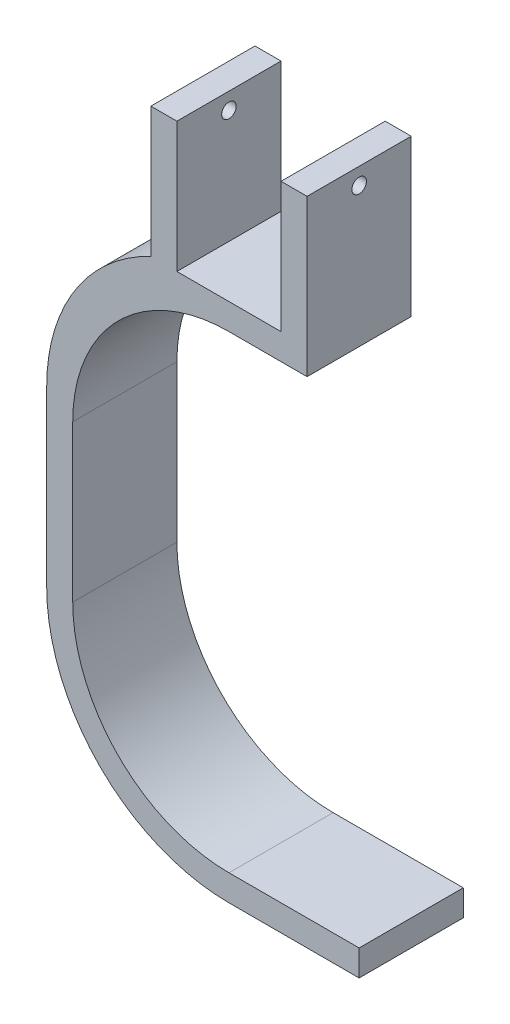
ISO-10303-21;
HEADER;
FILE_DESCRIPTION(('STEP AP214'),'2;1');
FILE_NAME('part.step','',(''),(''),'','','');
FILE_SCHEMA(('AUTOMOTIVE_DESIGN { 1 0 10303 214 1 1 1 1 }'));
ENDSEC;
DATA;
#1=APPLICATION_CONTEXT('core data for automotive mechanical design processes');
#2=APPLICATION_PROTOCOL_DEFINITION('international standard','automotive_design',2000,#1);
#3=PRODUCT_CONTEXT('',#1,'mechanical');
#4=PRODUCT('Part','Part','',(#3));
#5=PRODUCT_RELATED_PRODUCT_CATEGORY('part','',(#4));
#6=PRODUCT_DEFINITION_FORMATION('','',#4);
#7=PRODUCT_DEFINITION_CONTEXT('part definition',#1,'design');
#8=PRODUCT_DEFINITION('design','',#6,#7);
#9=PRODUCT_DEFINITION_SHAPE('','',#8);
#10=(LENGTH_UNIT() NAMED_UNIT(*) SI_UNIT(.MILLI.,.METRE.));
#11=(NAMED_UNIT(*) PLANE_ANGLE_UNIT() SI_UNIT($,.RADIAN.));
#12=(NAMED_UNIT(*) SI_UNIT($,.STERADIAN.) SOLID_ANGLE_UNIT());
#13=UNCERTAINTY_MEASURE_WITH_UNIT(LENGTH_MEASURE(1.E-05),#10,'distance_accuracy_value','');
#14=(GEOMETRIC_REPRESENTATION_CONTEXT(3) GLOBAL_UNCERTAINTY_ASSIGNED_CONTEXT((#13)) GLOBAL_UNIT_ASSIGNED_CONTEXT((#10,
#11,#12)) REPRESENTATION_CONTEXT('',''));
#15=CARTESIAN_POINT('',(0.,0.,0.));
#16=DIRECTION('',(0.,0.,1.));
#17=DIRECTION('',(1.,0.,0.));
#18=AXIS2_PLACEMENT_3D('',#15,#16,#17);
#19=CARTESIAN_POINT('',(0.,-55.535197077931,20.));
#20=DIRECTION('',(0.,1.,0.));
#21=DIRECTION('',(0.,0.,1.));
#22=AXIS2_PLACEMENT_3D('',#19,#20,#21);
#23=PLANE('',#22);
#24=DIRECTION('',(1.,0.,0.));
#25=VECTOR('',#24,1.);
#26=CARTESIAN_POINT('',(0.,-55.535197077931,20.));
#27=LINE('',#26,#25);
#28=CARTESIAN_POINT('',(21.4485078252592,-55.535197077931,20.));
#29=VERTEX_POINT('',#28);
#30=CARTESIAN_POINT('',(46.4485078252592,-55.535197077931,20.));
#31=VERTEX_POINT('',#30);
#32=EDGE_CURVE('E207',#29,#31,#27,.T.);
#33=ORIENTED_EDGE('',*,*,#32,.F.);
#34=DIRECTION('',(0.,0.,-1.));
#35=VECTOR('',#34,1.);
#36=CARTESIAN_POINT('',(21.4485078252592,-55.535197077931,20.));
#37=LINE('',#36,#35);
#38=CARTESIAN_POINT('',(21.4485078252592,-55.535197077931,0.));
#39=VERTEX_POINT('',#38);
#40=EDGE_CURVE('E286',#29,#39,#37,.T.);
#41=ORIENTED_EDGE('',*,*,#40,.T.);
#42=DIRECTION('',(1.,0.,0.));
#43=VECTOR('',#42,1.);
#44=CARTESIAN_POINT('',(0.,-55.535197077931,0.));
#45=LINE('',#44,#43);
#46=CARTESIAN_POINT('',(46.4485078252592,-55.535197077931,0.));
#47=VERTEX_POINT('',#46);
#48=EDGE_CURVE('E206',#39,#47,#45,.T.);
#49=ORIENTED_EDGE('',*,*,#48,.T.);
#50=DIRECTION('',(0.,0.,-1.));
#51=VECTOR('',#50,1.);
#52=CARTESIAN_POINT('',(46.4485078252592,-55.535197077931,20.));
#53=LINE('',#52,#51);
#54=EDGE_CURVE('E265',#31,#47,#53,.T.);
#55=ORIENTED_EDGE('',*,*,#54,.F.);
#56=EDGE_LOOP('',(#33,#41,#49,#55));
#57=FACE_BOUND('',#56,.T.);
#58=ADVANCED_FACE('F37',(#57),#23,.F.);
#59=CARTESIAN_POINT('',(46.4485078252592,0.,20.));
#60=DIRECTION('',(-1.,0.,0.));
#61=DIRECTION('',(0.,0.,1.));
#62=AXIS2_PLACEMENT_3D('',#59,#60,#61);
#63=PLANE('',#62);
#64=DIRECTION('',(0.,1.,0.));
#65=VECTOR('',#64,1.);
#66=CARTESIAN_POINT('',(46.4485078252592,0.,0.));
#67=LINE('',#66,#65);
#68=CARTESIAN_POINT('',(46.4485078252592,-50.535197077931,0.));
#69=VERTEX_POINT('',#68);
#70=EDGE_CURVE('E237',#47,#69,#67,.T.);
#71=ORIENTED_EDGE('',*,*,#70,.T.);
#72=DIRECTION('',(0.,0.,-1.));
#73=VECTOR('',#72,1.);
#74=CARTESIAN_POINT('',(46.4485078252592,-50.535197077931,20.));
#75=LINE('',#74,#73);
#76=CARTESIAN_POINT('',(46.4485078252592,-50.535197077931,20.));
#77=VERTEX_POINT('',#76);
#78=EDGE_CURVE('E262',#77,#69,#75,.T.);
#79=ORIENTED_EDGE('',*,*,#78,.F.);
#80=DIRECTION('',(0.,1.,0.));
#81=VECTOR('',#80,1.);
#82=CARTESIAN_POINT('',(46.4485078252592,0.,20.));
#83=LINE('',#82,#81);
#84=EDGE_CURVE('E209',#31,#77,#83,.T.);
#85=ORIENTED_EDGE('',*,*,#84,.F.);
#86=ORIENTED_EDGE('',*,*,#54,.T.);
#87=EDGE_LOOP('',(#71,#79,#85,#86));
#88=FACE_BOUND('',#87,.T.);
#89=ADVANCED_FACE('F315',(#88),#63,.F.);
#90=CARTESIAN_POINT('',(0.,-50.535197077931,20.));
#91=DIRECTION('',(0.,1.,0.));
#92=DIRECTION('',(0.,0.,1.));
#93=AXIS2_PLACEMENT_3D('',#90,#91,#92);
#94=PLANE('',#93);
#95=DIRECTION('',(1.,0.,0.));
#96=VECTOR('',#95,1.);
#97=CARTESIAN_POINT('',(0.,-50.535197077931,0.));
#98=LINE('',#97,#96);
#99=CARTESIAN_POINT('',(21.4485078252592,-50.535197077931,0.));
#100=VERTEX_POINT('',#99);
#101=EDGE_CURVE('E240',#100,#69,#98,.T.);
#102=ORIENTED_EDGE('',*,*,#101,.F.);
#103=DIRECTION('',(0.,0.,-1.));
#104=VECTOR('',#103,1.);
#105=CARTESIAN_POINT('',(21.4485078252592,-50.535197077931,20.));
#106=LINE('',#105,#104);
#107=CARTESIAN_POINT('',(21.4485078252592,-50.535197077931,20.));
#108=VERTEX_POINT('',#107);
#109=EDGE_CURVE('E273',#100,#108,#106,.F.);
#110=ORIENTED_EDGE('',*,*,#109,.T.);
#111=DIRECTION('',(1.,0.,0.));
#112=VECTOR('',#111,1.);
#113=CARTESIAN_POINT('',(0.,-50.535197077931,20.));
#114=LINE('',#113,#112);
#115=EDGE_CURVE('E213',#108,#77,#114,.T.);
#116=ORIENTED_EDGE('',*,*,#115,.T.);
#117=ORIENTED_EDGE('',*,*,#78,.T.);
#118=EDGE_LOOP('',(#102,#110,#116,#117));
#119=FACE_BOUND('',#118,.T.);
#120=ADVANCED_FACE('F318',(#119),#94,.T.);
#121=CARTESIAN_POINT('',(-8.55149217474082,0.,20.));
#122=DIRECTION('',(1.,0.,0.));
#123=DIRECTION('',(0.,1.,0.));
#124=AXIS2_PLACEMENT_3D('',#121,#122,#123);
#125=PLANE('',#124);
#126=DIRECTION('',(0.,-1.,0.));
#127=VECTOR('',#126,1.);
#128=CARTESIAN_POINT('',(-8.55149217474082,0.,20.));
#129=LINE('',#128,#127);
#130=CARTESIAN_POINT('',(-8.55149217474083,9.46480292206905,20.));
#131=VERTEX_POINT('',#130);
#132=CARTESIAN_POINT('',(-8.55149217474082,-20.535197077931,20.));
#133=VERTEX_POINT('',#132);
#134=EDGE_CURVE('E215',#131,#133,#129,.T.);
#135=ORIENTED_EDGE('',*,*,#134,.T.);
#136=DIRECTION('',(0.,0.,-1.));
#137=VECTOR('',#136,1.);
#138=CARTESIAN_POINT('',(-8.55149217474082,-20.535197077931,0.));
#139=LINE('',#138,#137);
#140=CARTESIAN_POINT('',(-8.55149217474082,-20.535197077931,0.));
#141=VERTEX_POINT('',#140);
#142=EDGE_CURVE('E270',#133,#141,#139,.T.);
#143=ORIENTED_EDGE('',*,*,#142,.T.);
#144=DIRECTION('',(0.,-1.,0.));
#145=VECTOR('',#144,1.);
#146=CARTESIAN_POINT('',(-8.55149217474082,0.,0.));
#147=LINE('',#146,#145);
#148=CARTESIAN_POINT('',(-8.55149217474083,9.46480292206905,0.));
#149=VERTEX_POINT('',#148);
#150=EDGE_CURVE('E242',#149,#141,#147,.T.);
#151=ORIENTED_EDGE('',*,*,#150,.F.);
#152=DIRECTION('',(0.,0.,-1.));
#153=VECTOR('',#152,1.);
#154=CARTESIAN_POINT('',(-8.55149217474083,9.46480292206905,20.));
#155=LINE('',#154,#153);
#156=EDGE_CURVE('E268',#149,#131,#155,.F.);
#157=ORIENTED_EDGE('',*,*,#156,.T.);
#158=EDGE_LOOP('',(#135,#143,#151,#157));
#159=FACE_BOUND('',#158,.T.);
#160=ADVANCED_FACE('F327',(#159),#125,.T.);
#161=CARTESIAN_POINT('',(0.,39.464802922069,20.));
#162=DIRECTION('',(0.,-1.,0.));
#163=DIRECTION('',(1.,0.,0.));
#164=AXIS2_PLACEMENT_3D('',#161,#162,#163);
#165=PLANE('',#164);
#166=DIRECTION('',(-1.,0.,0.));
#167=VECTOR('',#166,1.);
#168=CARTESIAN_POINT('',(0.,39.464802922069,20.));
#169=LINE('',#168,#167);
#170=CARTESIAN_POINT('',(36.4485078252592,39.464802922069,20.));
#171=VERTEX_POINT('',#170);
#172=CARTESIAN_POINT('',(21.4485078252592,39.464802922069,20.));
#173=VERTEX_POINT('',#172);
#174=EDGE_CURVE('E218',#171,#173,#169,.T.);
#175=ORIENTED_EDGE('',*,*,#174,.T.);
#176=DIRECTION('',(0.,0.,-1.));
#177=VECTOR('',#176,1.);
#178=CARTESIAN_POINT('',(21.4485078252592,39.464802922069,0.));
#179=LINE('',#178,#177);
#180=CARTESIAN_POINT('',(21.4485078252592,39.464802922069,0.));
#181=VERTEX_POINT('',#180);
#182=EDGE_CURVE('E275',#173,#181,#179,.T.);
#183=ORIENTED_EDGE('',*,*,#182,.T.);
#184=DIRECTION('',(-1.,0.,0.));
#185=VECTOR('',#184,1.);
#186=CARTESIAN_POINT('',(0.,39.464802922069,0.));
#187=LINE('',#186,#185);
#188=CARTESIAN_POINT('',(36.4485078252592,39.464802922069,0.));
#189=VERTEX_POINT('',#188);
#190=EDGE_CURVE('E168',#189,#181,#187,.T.);
#191=ORIENTED_EDGE('',*,*,#190,.F.);
#192=DIRECTION('',(0.,0.,-1.));
#193=VECTOR('',#192,1.);
#194=CARTESIAN_POINT('',(36.4485078252592,39.464802922069,20.));
#195=LINE('',#194,#193);
#196=EDGE_CURVE('E163',#171,#189,#195,.T.);
#197=ORIENTED_EDGE('',*,*,#196,.F.);
#198=EDGE_LOOP('',(#175,#183,#191,#197));
#199=FACE_BOUND('',#198,.T.);
#200=ADVANCED_FACE('F334',(#199),#165,.T.);
#201=CARTESIAN_POINT('',(36.4485078252592,0.,20.));
#202=DIRECTION('',(-1.,0.,0.));
#203=DIRECTION('',(0.,-1.,0.));
#204=AXIS2_PLACEMENT_3D('',#201,#202,#203);
#205=PLANE('',#204);
#206=CARTESIAN_POINT('',(36.4485078252592,66.264802922069,10.));
#207=DIRECTION('',(1.,0.,0.));
#208=DIRECTION('',(0.,1.,0.));
#209=AXIS2_PLACEMENT_3D('',#206,#207,#208);
#210=CIRCLE('',#209,1.4);
#211=CARTESIAN_POINT('',(36.4485078252592,67.664802922069,10.));
#212=VERTEX_POINT('',#211);
#213=EDGE_CURVE('E565',#212,#212,#210,.T.);
#214=ORIENTED_EDGE('',*,*,#213,.F.);
#215=EDGE_LOOP('',(#214));
#216=FACE_BOUND('',#215,.T.);
#217=DIRECTION('',(0.,1.,0.));
#218=VECTOR('',#217,1.);
#219=CARTESIAN_POINT('',(36.4485078252592,0.,0.));
#220=LINE('',#219,#218);
#221=CARTESIAN_POINT('',(36.4485078252591,69.4648029220691,0.));
#222=VERTEX_POINT('',#221);
#223=EDGE_CURVE('E157',#189,#222,#220,.T.);
#224=ORIENTED_EDGE('',*,*,#223,.T.);
#225=DIRECTION('',(0.,0.,-1.));
#226=VECTOR('',#225,1.);
#227=CARTESIAN_POINT('',(36.4485078252591,69.4648029220691,0.));
#228=LINE('',#227,#226);
#229=CARTESIAN_POINT('',(36.4485078252591,69.4648029220691,20.));
#230=VERTEX_POINT('',#229);
#231=EDGE_CURVE('E162',#230,#222,#228,.T.);
#232=ORIENTED_EDGE('',*,*,#231,.F.);
#233=DIRECTION('',(0.,1.,0.));
#234=VECTOR('',#233,1.);
#235=CARTESIAN_POINT('',(36.4485078252592,0.,20.));
#236=LINE('',#235,#234);
#237=EDGE_CURVE('E221',#171,#230,#236,.T.);
#238=ORIENTED_EDGE('',*,*,#237,.F.);
#239=ORIENTED_EDGE('',*,*,#196,.T.);
#240=EDGE_LOOP('',(#224,#232,#238,#239));
#241=FACE_BOUND('',#240,.T.);
#242=ADVANCED_FACE('F159',(#216,#241),#205,.F.);
#243=CARTESIAN_POINT('',(31.4485078252592,0.,20.));
#244=DIRECTION('',(1.,0.,0.));
#245=DIRECTION('',(0.,0.,-1.));
#246=AXIS2_PLACEMENT_3D('',#243,#244,#245);
#247=PLANE('',#246);
#248=CARTESIAN_POINT('',(31.4485078252592,66.264802922069,10.));
#249=DIRECTION('',(1.,0.,0.));
#250=DIRECTION('',(0.,0.,-1.));
#251=AXIS2_PLACEMENT_3D('',#248,#249,#250);
#252=CIRCLE('',#251,1.4);
#253=CARTESIAN_POINT('',(31.4485078252592,67.664802922069,10.));
#254=VERTEX_POINT('',#253);
#255=EDGE_CURVE('E185',#254,#254,#252,.T.);
#256=ORIENTED_EDGE('',*,*,#255,.T.);
#257=EDGE_LOOP('',(#256));
#258=FACE_BOUND('',#257,.T.);
#259=DIRECTION('',(0.,-1.,0.));
#260=VECTOR('',#259,1.);
#261=CARTESIAN_POINT('',(31.4485078252592,0.,0.));
#262=LINE('',#261,#260);
#263=CARTESIAN_POINT('',(31.4485078252591,69.4648029220691,0.));
#264=VERTEX_POINT('',#263);
#265=CARTESIAN_POINT('',(31.4485078252592,44.464802922069,0.));
#266=VERTEX_POINT('',#265);
#267=EDGE_CURVE('E167',#264,#266,#262,.T.);
#268=ORIENTED_EDGE('',*,*,#267,.T.);
#269=DIRECTION('',(0.,0.,-1.));
#270=VECTOR('',#269,1.);
#271=CARTESIAN_POINT('',(31.4485078252592,44.464802922069,20.));
#272=LINE('',#271,#270);
#273=CARTESIAN_POINT('',(31.4485078252592,44.464802922069,20.));
#274=VERTEX_POINT('',#273);
#275=EDGE_CURVE('E259',#274,#266,#272,.T.);
#276=ORIENTED_EDGE('',*,*,#275,.F.);
#277=DIRECTION('',(0.,-1.,0.));
#278=VECTOR('',#277,1.);
#279=CARTESIAN_POINT('',(31.4485078252592,0.,20.));
#280=LINE('',#279,#278);
#281=CARTESIAN_POINT('',(31.4485078252591,69.4648029220691,20.));
#282=VERTEX_POINT('',#281);
#283=EDGE_CURVE('E223',#282,#274,#280,.T.);
#284=ORIENTED_EDGE('',*,*,#283,.F.);
#285=DIRECTION('',(0.,0.,1.));
#286=VECTOR('',#285,1.);
#287=CARTESIAN_POINT('',(31.4485078252591,69.4648029220691,0.));
#288=LINE('',#287,#286);
#289=EDGE_CURVE('E179',#264,#282,#288,.T.);
#290=ORIENTED_EDGE('',*,*,#289,.F.);
#291=EDGE_LOOP('',(#268,#276,#284,#290));
#292=FACE_BOUND('',#291,.T.);
#293=ADVANCED_FACE('F339',(#258,#292),#247,.F.);
#294=CARTESIAN_POINT('',(0.,44.464802922069,20.));
#295=DIRECTION('',(0.,1.,0.));
#296=DIRECTION('',(0.,0.,1.));
#297=AXIS2_PLACEMENT_3D('',#294,#295,#296);
#298=PLANE('',#297);
#299=DIRECTION('',(1.,0.,0.));
#300=VECTOR('',#299,1.);
#301=CARTESIAN_POINT('',(0.,44.464802922069,0.));
#302=LINE('',#301,#300);
#303=CARTESIAN_POINT('',(11.4485078252592,44.464802922069,0.));
#304=VERTEX_POINT('',#303);
#305=EDGE_CURVE('E247',#304,#266,#302,.T.);
#306=ORIENTED_EDGE('',*,*,#305,.F.);
#307=DIRECTION('',(0.,0.,-1.));
#308=VECTOR('',#307,1.);
#309=CARTESIAN_POINT('',(11.4485078252592,44.464802922069,20.));
#310=LINE('',#309,#308);
#311=CARTESIAN_POINT('',(11.4485078252592,44.464802922069,20.));
#312=VERTEX_POINT('',#311);
#313=EDGE_CURVE('E257',#312,#304,#310,.T.);
#314=ORIENTED_EDGE('',*,*,#313,.F.);
#315=DIRECTION('',(1.,0.,0.));
#316=VECTOR('',#315,1.);
#317=CARTESIAN_POINT('',(0.,44.464802922069,20.));
#318=LINE('',#317,#316);
#319=EDGE_CURVE('E225',#312,#274,#318,.T.);
#320=ORIENTED_EDGE('',*,*,#319,.T.);
#321=ORIENTED_EDGE('',*,*,#275,.T.);
#322=EDGE_LOOP('',(#306,#314,#320,#321));
#323=FACE_BOUND('',#322,.T.);
#324=ADVANCED_FACE('F342',(#323),#298,.T.);
#325=CARTESIAN_POINT('',(11.4485078252592,0.,20.));
#326=DIRECTION('',(1.,0.,0.));
#327=DIRECTION('',(0.,1.,0.));
#328=AXIS2_PLACEMENT_3D('',#325,#326,#327);
#329=PLANE('',#328);
#330=CARTESIAN_POINT('',(11.4485078252592,66.264802922069,10.));
#331=DIRECTION('',(1.,0.,0.));
#332=DIRECTION('',(0.,1.,0.));
#333=AXIS2_PLACEMENT_3D('',#330,#331,#332);
#334=CIRCLE('',#333,1.4);
#335=CARTESIAN_POINT('',(11.4485078252592,67.664802922069,10.));
#336=VERTEX_POINT('',#335);
#337=EDGE_CURVE('E188',#336,#336,#334,.T.);
#338=ORIENTED_EDGE('',*,*,#337,.F.);
#339=EDGE_LOOP('',(#338));
#340=FACE_BOUND('',#339,.T.);
#341=DIRECTION('',(0.,-1.,0.));
#342=VECTOR('',#341,1.);
#343=CARTESIAN_POINT('',(11.4485078252592,0.,0.));
#344=LINE('',#343,#342);
#345=CARTESIAN_POINT('',(11.4485078252591,69.464802922069,0.));
#346=VERTEX_POINT('',#345);
#347=EDGE_CURVE('E249',#346,#304,#344,.T.);
#348=ORIENTED_EDGE('',*,*,#347,.F.);
#349=DIRECTION('',(0.,0.,-1.));
#350=VECTOR('',#349,1.);
#351=CARTESIAN_POINT('',(11.4485078252591,69.464802922069,0.));
#352=LINE('',#351,#350);
#353=CARTESIAN_POINT('',(11.4485078252591,69.464802922069,20.));
#354=VERTEX_POINT('',#353);
#355=EDGE_CURVE('E200',#354,#346,#352,.T.);
#356=ORIENTED_EDGE('',*,*,#355,.F.);
#357=DIRECTION('',(0.,-1.,0.));
#358=VECTOR('',#357,1.);
#359=CARTESIAN_POINT('',(11.4485078252592,0.,20.));
#360=LINE('',#359,#358);
#361=EDGE_CURVE('E228',#354,#312,#360,.T.);
#362=ORIENTED_EDGE('',*,*,#361,.T.);
#363=ORIENTED_EDGE('',*,*,#313,.T.);
#364=EDGE_LOOP('',(#348,#356,#362,#363));
#365=FACE_BOUND('',#364,.T.);
#366=ADVANCED_FACE('F344',(#340,#365),#329,.T.);
#367=CARTESIAN_POINT('',(6.44850782525917,0.,20.));
#368=DIRECTION('',(-1.,0.,0.));
#369=DIRECTION('',(0.,0.,1.));
#370=AXIS2_PLACEMENT_3D('',#367,#368,#369);
#371=PLANE('',#370);
#372=CARTESIAN_POINT('',(6.44850782525917,66.264802922069,10.));
#373=DIRECTION('',(-1.,0.,0.));
#374=DIRECTION('',(0.,0.,1.));
#375=AXIS2_PLACEMENT_3D('',#372,#373,#374);
#376=CIRCLE('',#375,1.4);
#377=CARTESIAN_POINT('',(6.44850782525917,67.664802922069,10.));
#378=VERTEX_POINT('',#377);
#379=EDGE_CURVE('E41',#378,#378,#376,.T.);
#380=ORIENTED_EDGE('',*,*,#379,.F.);
#381=EDGE_LOOP('',(#380));
#382=FACE_BOUND('',#381,.T.);
#383=DIRECTION('',(0.,1.,0.));
#384=VECTOR('',#383,1.);
#385=CARTESIAN_POINT('',(6.44850782525917,0.,0.));
#386=LINE('',#385,#384);
#387=CARTESIAN_POINT('',(6.44850782525917,44.464802922069,0.));
#388=VERTEX_POINT('',#387);
#389=CARTESIAN_POINT('',(6.44850782525915,69.464802922069,0.));
#390=VERTEX_POINT('',#389);
#391=EDGE_CURVE('E252',#388,#390,#386,.T.);
#392=ORIENTED_EDGE('',*,*,#391,.F.);
#393=DIRECTION('',(0.,0.,-1.));
#394=VECTOR('',#393,1.);
#395=CARTESIAN_POINT('',(6.44850782525917,44.464802922069,20.));
#396=LINE('',#395,#394);
#397=CARTESIAN_POINT('',(6.44850782525917,44.464802922069,20.));
#398=VERTEX_POINT('',#397);
#399=EDGE_CURVE('E235',#398,#388,#396,.T.);
#400=ORIENTED_EDGE('',*,*,#399,.F.);
#401=DIRECTION('',(0.,1.,0.));
#402=VECTOR('',#401,1.);
#403=CARTESIAN_POINT('',(6.44850782525917,0.,20.));
#404=LINE('',#403,#402);
#405=CARTESIAN_POINT('',(6.44850782525915,69.464802922069,20.));
#406=VERTEX_POINT('',#405);
#407=EDGE_CURVE('E231',#398,#406,#404,.T.);
#408=ORIENTED_EDGE('',*,*,#407,.T.);
#409=DIRECTION('',(0.,0.,1.));
#410=VECTOR('',#409,1.);
#411=CARTESIAN_POINT('',(6.44850782525915,69.464802922069,0.));
#412=LINE('',#411,#410);
#413=EDGE_CURVE('E194',#390,#406,#412,.T.);
#414=ORIENTED_EDGE('',*,*,#413,.F.);
#415=EDGE_LOOP('',(#392,#400,#408,#414));
#416=FACE_BOUND('',#415,.T.);
#417=ADVANCED_FACE('F352',(#382,#416),#371,.T.);
#418=CARTESIAN_POINT('',(-13.5514921747408,0.,20.));
#419=DIRECTION('',(1.,0.,0.));
#420=DIRECTION('',(0.,0.,-1.));
#421=AXIS2_PLACEMENT_3D('',#418,#419,#420);
#422=PLANE('',#421);
#423=DIRECTION('',(0.,-1.,0.));
#424=VECTOR('',#423,1.);
#425=CARTESIAN_POINT('',(-13.5514921747408,0.,0.));
#426=LINE('',#425,#424);
#427=CARTESIAN_POINT('',(-13.5514921747408,12.8420263203852,0.));
#428=VERTEX_POINT('',#427);
#429=CARTESIAN_POINT('',(-13.5514921747408,-20.535197077931,0.));
#430=VERTEX_POINT('',#429);
#431=EDGE_CURVE('E210',#428,#430,#426,.T.);
#432=ORIENTED_EDGE('',*,*,#431,.T.);
#433=DIRECTION('',(0.,0.,-1.));
#434=VECTOR('',#433,1.);
#435=CARTESIAN_POINT('',(-13.5514921747408,-20.535197077931,20.));
#436=LINE('',#435,#434);
#437=CARTESIAN_POINT('',(-13.5514921747408,-20.535197077931,20.));
#438=VERTEX_POINT('',#437);
#439=EDGE_CURVE('E53',#430,#438,#436,.F.);
#440=ORIENTED_EDGE('',*,*,#439,.T.);
#441=DIRECTION('',(0.,-1.,0.));
#442=VECTOR('',#441,1.);
#443=CARTESIAN_POINT('',(-13.5514921747408,0.,20.));
#444=LINE('',#443,#442);
#445=CARTESIAN_POINT('',(-13.5514921747408,12.8420263203852,20.));
#446=VERTEX_POINT('',#445);
#447=EDGE_CURVE('E233',#446,#438,#444,.T.);
#448=ORIENTED_EDGE('',*,*,#447,.F.);
#449=DIRECTION('',(0.,0.,-1.));
#450=VECTOR('',#449,1.);
#451=CARTESIAN_POINT('',(-13.5514921747408,12.8420263203852,20.));
#452=LINE('',#451,#450);
#453=EDGE_CURVE('E293',#446,#428,#452,.T.);
#454=ORIENTED_EDGE('',*,*,#453,.T.);
#455=EDGE_LOOP('',(#432,#440,#448,#454));
#456=FACE_BOUND('',#455,.T.);
#457=ADVANCED_FACE('F299',(#456),#422,.F.);
#458=CARTESIAN_POINT('',(0.,0.,20.));
#459=DIRECTION('',(0.,0.,1.));
#460=DIRECTION('',(1.,0.,0.));
#461=AXIS2_PLACEMENT_3D('',#458,#459,#460);
#462=PLANE('',#461);
#463=ORIENTED_EDGE('',*,*,#447,.T.);
#464=CARTESIAN_POINT('',(21.4485078252592,-20.535197077931,20.));
#465=DIRECTION('',(0.,0.,1.));
#466=DIRECTION('',(1.,0.,0.));
#467=AXIS2_PLACEMENT_3D('',#464,#465,#466);
#468=CIRCLE('',#467,35.);
#469=EDGE_CURVE('E11',#438,#29,#468,.T.);
#470=ORIENTED_EDGE('',*,*,#469,.T.);
#471=ORIENTED_EDGE('',*,*,#32,.T.);
#472=ORIENTED_EDGE('',*,*,#84,.T.);
#473=ORIENTED_EDGE('',*,*,#115,.F.);
#474=CARTESIAN_POINT('',(21.4485078252592,-20.535197077931,20.));
#475=DIRECTION('',(0.,0.,1.));
#476=DIRECTION('',(1.,0.,0.));
#477=AXIS2_PLACEMENT_3D('',#474,#475,#476);
#478=CIRCLE('',#477,30.);
#479=EDGE_CURVE('E280',#108,#133,#478,.F.);
#480=ORIENTED_EDGE('',*,*,#479,.T.);
#481=ORIENTED_EDGE('',*,*,#134,.F.);
#482=CARTESIAN_POINT('',(21.4485078252592,9.46480292206905,20.));
#483=DIRECTION('',(0.,0.,1.));
#484=DIRECTION('',(1.,0.,0.));
#485=AXIS2_PLACEMENT_3D('',#482,#483,#484);
#486=CIRCLE('',#485,30.);
#487=EDGE_CURVE('E284',#131,#173,#486,.F.);
#488=ORIENTED_EDGE('',*,*,#487,.T.);
#489=ORIENTED_EDGE('',*,*,#174,.F.);
#490=ORIENTED_EDGE('',*,*,#237,.T.);
#491=DIRECTION('',(1.,0.,0.));
#492=VECTOR('',#491,1.);
#493=CARTESIAN_POINT('',(36.4485078252591,69.4648029220691,20.));
#494=LINE('',#493,#492);
#495=EDGE_CURVE('E184',#282,#230,#494,.T.);
#496=ORIENTED_EDGE('',*,*,#495,.F.);
#497=ORIENTED_EDGE('',*,*,#283,.T.);
#498=ORIENTED_EDGE('',*,*,#319,.F.);
#499=ORIENTED_EDGE('',*,*,#361,.F.);
#500=DIRECTION('',(1.,0.,0.));
#501=VECTOR('',#500,1.);
#502=CARTESIAN_POINT('',(6.44850782525915,69.464802922069,20.));
#503=LINE('',#502,#501);
#504=EDGE_CURVE('E197',#406,#354,#503,.T.);
#505=ORIENTED_EDGE('',*,*,#504,.F.);
#506=ORIENTED_EDGE('',*,*,#407,.F.);
#507=CARTESIAN_POINT('',(21.4485078252592,12.8420263203852,20.));
#508=DIRECTION('',(0.,0.,1.));
#509=DIRECTION('',(1.,0.,0.));
#510=AXIS2_PLACEMENT_3D('',#507,#508,#509);
#511=CIRCLE('',#510,35.);
#512=EDGE_CURVE('E46',#398,#446,#511,.T.);
#513=ORIENTED_EDGE('',*,*,#512,.T.);
#514=EDGE_LOOP('',(#463,#470,#471,#472,#473,#480,#481,#488,#489,#490,#496,#497,#498,#499,#505,
#506,#513));
#515=FACE_BOUND('',#514,.T.);
#516=ADVANCED_FACE('F311',(#515),#462,.T.);
#517=CARTESIAN_POINT('',(0.,0.,0.));
#518=DIRECTION('',(0.,0.,1.));
#519=DIRECTION('',(1.,0.,0.));
#520=AXIS2_PLACEMENT_3D('',#517,#518,#519);
#521=PLANE('',#520);
#522=ORIENTED_EDGE('',*,*,#48,.F.);
#523=CARTESIAN_POINT('',(21.4485078252592,-20.535197077931,0.));
#524=DIRECTION('',(0.,0.,1.));
#525=DIRECTION('',(1.,0.,0.));
#526=AXIS2_PLACEMENT_3D('',#523,#524,#525);
#527=CIRCLE('',#526,35.);
#528=EDGE_CURVE('E291',#39,#430,#527,.F.);
#529=ORIENTED_EDGE('',*,*,#528,.T.);
#530=ORIENTED_EDGE('',*,*,#431,.F.);
#531=CARTESIAN_POINT('',(21.4485078252592,12.8420263203852,0.));
#532=DIRECTION('',(0.,0.,1.));
#533=DIRECTION('',(1.,0.,0.));
#534=AXIS2_PLACEMENT_3D('',#531,#532,#533);
#535=CIRCLE('',#534,35.);
#536=EDGE_CURVE('E289',#428,#388,#535,.F.);
#537=ORIENTED_EDGE('',*,*,#536,.T.);
#538=ORIENTED_EDGE('',*,*,#391,.T.);
#539=DIRECTION('',(-1.,0.,0.));
#540=VECTOR('',#539,1.);
#541=CARTESIAN_POINT('',(6.44850782525915,69.464802922069,0.));
#542=LINE('',#541,#540);
#543=EDGE_CURVE('E203',#346,#390,#542,.T.);
#544=ORIENTED_EDGE('',*,*,#543,.F.);
#545=ORIENTED_EDGE('',*,*,#347,.T.);
#546=ORIENTED_EDGE('',*,*,#305,.T.);
#547=ORIENTED_EDGE('',*,*,#267,.F.);
#548=DIRECTION('',(-1.,0.,0.));
#549=VECTOR('',#548,1.);
#550=CARTESIAN_POINT('',(36.4485078252591,69.4648029220691,0.));
#551=LINE('',#550,#549);
#552=EDGE_CURVE('E171',#222,#264,#551,.T.);
#553=ORIENTED_EDGE('',*,*,#552,.F.);
#554=ORIENTED_EDGE('',*,*,#223,.F.);
#555=ORIENTED_EDGE('',*,*,#190,.T.);
#556=CARTESIAN_POINT('',(21.4485078252592,9.46480292206905,0.));
#557=DIRECTION('',(0.,0.,1.));
#558=DIRECTION('',(1.,0.,0.));
#559=AXIS2_PLACEMENT_3D('',#556,#557,#558);
#560=CIRCLE('',#559,30.);
#561=EDGE_CURVE('E282',#181,#149,#560,.T.);
#562=ORIENTED_EDGE('',*,*,#561,.T.);
#563=ORIENTED_EDGE('',*,*,#150,.T.);
#564=CARTESIAN_POINT('',(21.4485078252592,-20.535197077931,0.));
#565=DIRECTION('',(0.,0.,1.));
#566=DIRECTION('',(1.,0.,0.));
#567=AXIS2_PLACEMENT_3D('',#564,#565,#566);
#568=CIRCLE('',#567,30.);
#569=EDGE_CURVE('E278',#141,#100,#568,.T.);
#570=ORIENTED_EDGE('',*,*,#569,.T.);
#571=ORIENTED_EDGE('',*,*,#101,.T.);
#572=ORIENTED_EDGE('',*,*,#70,.F.);
#573=EDGE_LOOP('',(#522,#529,#530,#537,#538,#544,#545,#546,#547,#553,#554,#555,#562,#563,#570,
#571,#572));
#574=FACE_BOUND('',#573,.T.);
#575=ADVANCED_FACE('F173',(#574),#521,.F.);
#576=CARTESIAN_POINT('',(21.4485078252592,-20.535197077931,20.));
#577=DIRECTION('',(0.,0.,1.));
#578=DIRECTION('',(1.,0.,0.));
#579=AXIS2_PLACEMENT_3D('',#576,#577,#578);
#580=CYLINDRICAL_SURFACE('',#579,30.);
#581=ORIENTED_EDGE('',*,*,#479,.F.);
#582=ORIENTED_EDGE('',*,*,#109,.F.);
#583=ORIENTED_EDGE('',*,*,#569,.F.);
#584=ORIENTED_EDGE('',*,*,#142,.F.);
#585=EDGE_LOOP('',(#581,#582,#583,#584));
#586=FACE_BOUND('',#585,.T.);
#587=ADVANCED_FACE('F324',(#586),#580,.F.);
#588=CARTESIAN_POINT('',(21.4485078252592,9.46480292206905,20.));
#589=DIRECTION('',(0.,0.,1.));
#590=DIRECTION('',(1.,0.,0.));
#591=AXIS2_PLACEMENT_3D('',#588,#589,#590);
#592=CYLINDRICAL_SURFACE('',#591,30.);
#593=ORIENTED_EDGE('',*,*,#487,.F.);
#594=ORIENTED_EDGE('',*,*,#156,.F.);
#595=ORIENTED_EDGE('',*,*,#561,.F.);
#596=ORIENTED_EDGE('',*,*,#182,.F.);
#597=EDGE_LOOP('',(#593,#594,#595,#596));
#598=FACE_BOUND('',#597,.T.);
#599=ADVANCED_FACE('F332',(#598),#592,.F.);
#600=CARTESIAN_POINT('',(21.4485078252592,-20.535197077931,20.));
#601=DIRECTION('',(0.,0.,-1.));
#602=DIRECTION('',(-1.,0.,0.));
#603=AXIS2_PLACEMENT_3D('',#600,#601,#602);
#604=CYLINDRICAL_SURFACE('',#603,35.);
#605=ORIENTED_EDGE('',*,*,#469,.F.);
#606=ORIENTED_EDGE('',*,*,#439,.F.);
#607=ORIENTED_EDGE('',*,*,#528,.F.);
#608=ORIENTED_EDGE('',*,*,#40,.F.);
#609=EDGE_LOOP('',(#605,#606,#607,#608));
#610=FACE_BOUND('',#609,.T.);
#611=ADVANCED_FACE('F306',(#610),#604,.T.);
#612=CARTESIAN_POINT('',(21.4485078252592,12.8420263203852,20.));
#613=DIRECTION('',(0.,0.,-1.));
#614=DIRECTION('',(-1.,0.,0.));
#615=AXIS2_PLACEMENT_3D('',#612,#613,#614);
#616=CYLINDRICAL_SURFACE('',#615,35.);
#617=ORIENTED_EDGE('',*,*,#512,.F.);
#618=ORIENTED_EDGE('',*,*,#399,.T.);
#619=ORIENTED_EDGE('',*,*,#536,.F.);
#620=ORIENTED_EDGE('',*,*,#453,.F.);
#621=EDGE_LOOP('',(#617,#618,#619,#620));
#622=FACE_BOUND('',#621,.T.);
#623=ADVANCED_FACE('F39',(#622),#616,.T.);
#624=CARTESIAN_POINT('',(0.,69.464802922069,0.));
#625=DIRECTION('',(0.,1.,0.));
#626=DIRECTION('',(-1.,0.,0.));
#627=AXIS2_PLACEMENT_3D('',#624,#625,#626);
#628=PLANE('',#627);
#629=ORIENTED_EDGE('',*,*,#413,.T.);
#630=ORIENTED_EDGE('',*,*,#504,.T.);
#631=ORIENTED_EDGE('',*,*,#355,.T.);
#632=ORIENTED_EDGE('',*,*,#543,.T.);
#633=EDGE_LOOP('',(#629,#630,#631,#632));
#634=FACE_BOUND('',#633,.T.);
#635=ADVANCED_FACE('F348',(#634),#628,.T.);
#636=CARTESIAN_POINT('',(0.,69.464802922069,0.));
#637=DIRECTION('',(0.,-1.,0.));
#638=DIRECTION('',(1.,0.,0.));
#639=AXIS2_PLACEMENT_3D('',#636,#637,#638);
#640=PLANE('',#639);
#641=ORIENTED_EDGE('',*,*,#231,.T.);
#642=ORIENTED_EDGE('',*,*,#552,.T.);
#643=ORIENTED_EDGE('',*,*,#289,.T.);
#644=ORIENTED_EDGE('',*,*,#495,.T.);
#645=EDGE_LOOP('',(#641,#642,#643,#644));
#646=FACE_BOUND('',#645,.T.);
#647=ADVANCED_FACE('F182',(#646),#640,.F.);
#648=CARTESIAN_POINT('',(-8.55149217474084,66.264802922069,10.));
#649=DIRECTION('',(1.,0.,0.));
#650=DIRECTION('',(0.,1.,0.));
#651=AXIS2_PLACEMENT_3D('',#648,#649,#650);
#652=CYLINDRICAL_SURFACE('',#651,1.4);
#653=CARTESIAN_POINT('',(11.4485078252592,67.664802922069,10.));
#654=CARTESIAN_POINT('',(11.3964244919258,67.664802922069,10.));
#655=CARTESIAN_POINT('',(11.3443411585925,67.664802922069,10.));
#656=CARTESIAN_POINT('',(11.2401744919258,67.664802922069,10.));
#657=CARTESIAN_POINT('',(11.1880911585925,67.664802922069,10.));
#658=CARTESIAN_POINT('',(11.0839244919258,67.664802922069,10.));
#659=CARTESIAN_POINT('',(11.0318411585925,67.664802922069,10.));
#660=CARTESIAN_POINT('',(10.9276744919258,67.664802922069,10.));
#661=CARTESIAN_POINT('',(10.8755911585925,67.664802922069,10.));
#662=CARTESIAN_POINT('',(10.7714244919258,67.664802922069,10.));
#663=CARTESIAN_POINT('',(10.7193411585925,67.664802922069,10.));
#664=CARTESIAN_POINT('',(10.6151744919258,67.664802922069,10.));
#665=CARTESIAN_POINT('',(10.5630911585925,67.664802922069,10.));
#666=CARTESIAN_POINT('',(10.4589244919258,67.664802922069,10.));
#667=CARTESIAN_POINT('',(10.4068411585925,67.664802922069,10.));
#668=CARTESIAN_POINT('',(10.3026744919258,67.664802922069,10.));
#669=CARTESIAN_POINT('',(10.2505911585925,67.664802922069,10.));
#670=CARTESIAN_POINT('',(10.1464244919258,67.664802922069,10.));
#671=CARTESIAN_POINT('',(10.0943411585925,67.664802922069,10.));
#672=CARTESIAN_POINT('',(9.99017449192583,67.664802922069,10.));
#673=CARTESIAN_POINT('',(9.9380911585925,67.664802922069,10.));
#674=CARTESIAN_POINT('',(9.83392449192583,67.664802922069,10.));
#675=CARTESIAN_POINT('',(9.7818411585925,67.664802922069,10.));
#676=CARTESIAN_POINT('',(9.67767449192583,67.664802922069,10.));
#677=CARTESIAN_POINT('',(9.6255911585925,67.664802922069,10.));
#678=CARTESIAN_POINT('',(9.52142449192583,67.664802922069,10.));
#679=CARTESIAN_POINT('',(9.4693411585925,67.664802922069,10.));
#680=CARTESIAN_POINT('',(9.36517449192583,67.664802922069,10.));
#681=CARTESIAN_POINT('',(9.3130911585925,67.664802922069,10.));
#682=CARTESIAN_POINT('',(9.20892449192583,67.664802922069,10.));
#683=CARTESIAN_POINT('',(9.1568411585925,67.664802922069,10.));
#684=CARTESIAN_POINT('',(9.05267449192583,67.664802922069,10.));
#685=CARTESIAN_POINT('',(9.0005911585925,67.664802922069,10.));
#686=CARTESIAN_POINT('',(8.89642449192583,67.664802922069,10.));
#687=CARTESIAN_POINT('',(8.8443411585925,67.664802922069,10.));
#688=CARTESIAN_POINT('',(8.74017449192583,67.664802922069,10.));
#689=CARTESIAN_POINT('',(8.6880911585925,67.664802922069,10.));
#690=CARTESIAN_POINT('',(8.58392449192583,67.664802922069,10.));
#691=CARTESIAN_POINT('',(8.5318411585925,67.664802922069,10.));
#692=CARTESIAN_POINT('',(8.42767449192583,67.664802922069,10.));
#693=CARTESIAN_POINT('',(8.3755911585925,67.664802922069,10.));
#694=CARTESIAN_POINT('',(8.27142449192583,67.664802922069,10.));
#695=CARTESIAN_POINT('',(8.2193411585925,67.664802922069,10.));
#696=CARTESIAN_POINT('',(8.11517449192583,67.664802922069,10.));
#697=CARTESIAN_POINT('',(8.0630911585925,67.664802922069,10.));
#698=CARTESIAN_POINT('',(7.95892449192583,67.664802922069,10.));
#699=CARTESIAN_POINT('',(7.9068411585925,67.664802922069,10.));
#700=CARTESIAN_POINT('',(7.80267449192583,67.664802922069,10.));
#701=CARTESIAN_POINT('',(7.7505911585925,67.664802922069,10.));
#702=CARTESIAN_POINT('',(7.64642449192583,67.664802922069,10.));
#703=CARTESIAN_POINT('',(7.5943411585925,67.664802922069,10.));
#704=CARTESIAN_POINT('',(7.49017449192583,67.664802922069,10.));
#705=CARTESIAN_POINT('',(7.4380911585925,67.664802922069,10.));
#706=CARTESIAN_POINT('',(7.33392449192583,67.664802922069,10.));
#707=CARTESIAN_POINT('',(7.2818411585925,67.664802922069,10.));
#708=CARTESIAN_POINT('',(7.17767449192583,67.664802922069,10.));
#709=CARTESIAN_POINT('',(7.1255911585925,67.664802922069,10.));
#710=CARTESIAN_POINT('',(7.02142449192583,67.664802922069,10.));
#711=CARTESIAN_POINT('',(6.9693411585925,67.664802922069,10.));
#712=CARTESIAN_POINT('',(6.86517449192583,67.664802922069,10.));
#713=CARTESIAN_POINT('',(6.8130911585925,67.664802922069,10.));
#714=CARTESIAN_POINT('',(6.70892449192583,67.664802922069,10.));
#715=CARTESIAN_POINT('',(6.6568411585925,67.664802922069,10.));
#716=CARTESIAN_POINT('',(6.55267449192583,67.664802922069,10.));
#717=CARTESIAN_POINT('',(6.5005911585925,67.664802922069,10.));
#718=CARTESIAN_POINT('',(6.44850782525917,67.664802922069,10.));
#719=B_SPLINE_CURVE_WITH_KNOTS('',3,(#653,#654,#655,#656,#657,#658,#659,#660,#661,#662,#663,
#664,#665,#666,#667,#668,#669,#670,#671,#672,#673,#674,#675,#676,#677,#678,#679,#680,#681,#682,
#683,#684,#685,#686,#687,#688,#689,#690,#691,#692,#693,#694,#695,#696,#697,#698,#699,#700,#701,
#702,#703,#704,#705,#706,#707,#708,#709,#710,#711,#712,#713,#714,#715,#716,#717,#718),
.UNSPECIFIED.,.F.,.F.,(4,2,2,2,2,2,2,2,2,2,2,2,2,2,2,2,2,2,2,2,2,2,2,2,2,2,2,2,2,2,2,2,4),(0.,
0.15625,0.3125,0.46875,0.625000000000001,0.781250000000001,0.937500000000001,1.09375,1.25,
1.40625,1.5625,1.71875,1.875,2.03125,2.1875,2.34375,2.5,2.65625,2.8125,2.96875,3.125,3.28125,
3.4375,3.59375,3.75,3.90625,4.0625,4.21875,4.375,4.53125,4.6875,4.84375,5.),.UNSPECIFIED.);
#720=EDGE_CURVE('BSEAM422',#336,#378,#719,.T.);
#721=ORIENTED_EDGE('',*,*,#337,.T.);
#722=ORIENTED_EDGE('',*,*,#379,.T.);
#723=ORIENTED_EDGE('',*,*,#720,.T.);
#724=ORIENTED_EDGE('',*,*,#720,.F.);
#725=EDGE_LOOP('',(#721,#723,#722,#724));
#726=FACE_BOUND('',#725,.T.);
#727=ADVANCED_FACE('F422',(#726),#652,.F.);
#728=CARTESIAN_POINT('',(36.4485078252592,67.664802922069,10.));
#729=CARTESIAN_POINT('',(36.3964244919258,67.664802922069,10.));
#730=CARTESIAN_POINT('',(36.3443411585925,67.664802922069,10.));
#731=CARTESIAN_POINT('',(36.2401744919258,67.664802922069,10.));
#732=CARTESIAN_POINT('',(36.1880911585925,67.664802922069,10.));
#733=CARTESIAN_POINT('',(36.0839244919258,67.664802922069,10.));
#734=CARTESIAN_POINT('',(36.0318411585925,67.664802922069,10.));
#735=CARTESIAN_POINT('',(35.9276744919258,67.664802922069,10.));
#736=CARTESIAN_POINT('',(35.8755911585925,67.664802922069,10.));
#737=CARTESIAN_POINT('',(35.7714244919258,67.664802922069,10.));
#738=CARTESIAN_POINT('',(35.7193411585925,67.664802922069,10.));
#739=CARTESIAN_POINT('',(35.6151744919258,67.664802922069,10.));
#740=CARTESIAN_POINT('',(35.5630911585925,67.664802922069,10.));
#741=CARTESIAN_POINT('',(35.4589244919258,67.664802922069,10.));
#742=CARTESIAN_POINT('',(35.4068411585925,67.664802922069,10.));
#743=CARTESIAN_POINT('',(35.3026744919258,67.664802922069,10.));
#744=CARTESIAN_POINT('',(35.2505911585925,67.664802922069,10.));
#745=CARTESIAN_POINT('',(35.1464244919258,67.664802922069,10.));
#746=CARTESIAN_POINT('',(35.0943411585925,67.664802922069,10.));
#747=CARTESIAN_POINT('',(34.9901744919258,67.664802922069,10.));
#748=CARTESIAN_POINT('',(34.9380911585925,67.664802922069,10.));
#749=CARTESIAN_POINT('',(34.8339244919258,67.664802922069,10.));
#750=CARTESIAN_POINT('',(34.7818411585925,67.664802922069,10.));
#751=CARTESIAN_POINT('',(34.6776744919258,67.664802922069,10.));
#752=CARTESIAN_POINT('',(34.6255911585925,67.664802922069,10.));
#753=CARTESIAN_POINT('',(34.5214244919258,67.664802922069,10.));
#754=CARTESIAN_POINT('',(34.4693411585925,67.664802922069,10.));
#755=CARTESIAN_POINT('',(34.3651744919258,67.664802922069,10.));
#756=CARTESIAN_POINT('',(34.3130911585925,67.664802922069,10.));
#757=CARTESIAN_POINT('',(34.2089244919258,67.664802922069,10.));
#758=CARTESIAN_POINT('',(34.1568411585925,67.664802922069,10.));
#759=CARTESIAN_POINT('',(34.0526744919258,67.664802922069,10.));
#760=CARTESIAN_POINT('',(34.0005911585925,67.664802922069,10.));
#761=CARTESIAN_POINT('',(33.8964244919258,67.664802922069,10.));
#762=CARTESIAN_POINT('',(33.8443411585925,67.664802922069,10.));
#763=CARTESIAN_POINT('',(33.7401744919258,67.664802922069,10.));
#764=CARTESIAN_POINT('',(33.6880911585925,67.664802922069,10.));
#765=CARTESIAN_POINT('',(33.5839244919258,67.664802922069,10.));
#766=CARTESIAN_POINT('',(33.5318411585925,67.664802922069,10.));
#767=CARTESIAN_POINT('',(33.4276744919258,67.664802922069,10.));
#768=CARTESIAN_POINT('',(33.3755911585925,67.664802922069,10.));
#769=CARTESIAN_POINT('',(33.2714244919258,67.664802922069,10.));
#770=CARTESIAN_POINT('',(33.2193411585925,67.664802922069,10.));
#771=CARTESIAN_POINT('',(33.1151744919258,67.664802922069,10.));
#772=CARTESIAN_POINT('',(33.0630911585925,67.664802922069,10.));
#773=CARTESIAN_POINT('',(32.9589244919258,67.664802922069,10.));
#774=CARTESIAN_POINT('',(32.9068411585925,67.664802922069,10.));
#775=CARTESIAN_POINT('',(32.8026744919258,67.664802922069,10.));
#776=CARTESIAN_POINT('',(32.7505911585925,67.664802922069,10.));
#777=CARTESIAN_POINT('',(32.6464244919258,67.664802922069,10.));
#778=CARTESIAN_POINT('',(32.5943411585925,67.664802922069,10.));
#779=CARTESIAN_POINT('',(32.4901744919258,67.664802922069,10.));
#780=CARTESIAN_POINT('',(32.4380911585925,67.664802922069,10.));
#781=CARTESIAN_POINT('',(32.3339244919258,67.664802922069,10.));
#782=CARTESIAN_POINT('',(32.2818411585925,67.664802922069,10.));
#783=CARTESIAN_POINT('',(32.1776744919258,67.664802922069,10.));
#784=CARTESIAN_POINT('',(32.1255911585925,67.664802922069,10.));
#785=CARTESIAN_POINT('',(32.0214244919258,67.664802922069,10.));
#786=CARTESIAN_POINT('',(31.9693411585925,67.664802922069,10.));
#787=CARTESIAN_POINT('',(31.8651744919258,67.664802922069,10.));
#788=CARTESIAN_POINT('',(31.8130911585925,67.664802922069,10.));
#789=CARTESIAN_POINT('',(31.7089244919258,67.664802922069,10.));
#790=CARTESIAN_POINT('',(31.6568411585925,67.664802922069,10.));
#791=CARTESIAN_POINT('',(31.5526744919258,67.664802922069,10.));
#792=CARTESIAN_POINT('',(31.5005911585925,67.664802922069,10.));
#793=CARTESIAN_POINT('',(31.4485078252592,67.664802922069,10.));
#794=B_SPLINE_CURVE_WITH_KNOTS('',3,(#728,#729,#730,#731,#732,#733,#734,#735,#736,#737,#738,
#739,#740,#741,#742,#743,#744,#745,#746,#747,#748,#749,#750,#751,#752,#753,#754,#755,#756,#757,
#758,#759,#760,#761,#762,#763,#764,#765,#766,#767,#768,#769,#770,#771,#772,#773,#774,#775,#776,
#777,#778,#779,#780,#781,#782,#783,#784,#785,#786,#787,#788,#789,#790,#791,#792,#793),
.UNSPECIFIED.,.F.,.F.,(4,2,2,2,2,2,2,2,2,2,2,2,2,2,2,2,2,2,2,2,2,2,2,2,2,2,2,2,2,2,2,2,4),(0.,
0.156249999999997,0.3125,0.468750000000004,0.625000000000001,0.781249999999997,
0.937500000000001,1.09375,1.25,1.40625,1.5625,1.71875,1.875,2.03125,2.1875,2.34375000000001,2.5,
2.65625,2.8125,2.96875000000001,3.125,3.28125,3.4375,3.59375000000001,3.75,3.90625,4.0625,
4.21875000000001,4.375,4.53125,4.6875,4.84375000000001,5.),.UNSPECIFIED.);
#795=EDGE_CURVE('BSEAM468',#212,#254,#794,.T.);
#796=ORIENTED_EDGE('',*,*,#213,.T.);
#797=ORIENTED_EDGE('',*,*,#255,.F.);
#798=ORIENTED_EDGE('',*,*,#795,.T.);
#799=ORIENTED_EDGE('',*,*,#795,.F.);
#800=EDGE_LOOP('',(#796,#798,#797,#799));
#801=FACE_BOUND('',#800,.T.);
#802=ADVANCED_FACE('F468',(#801),#652,.F.);
#803=CLOSED_SHELL('',(#58,#89,#120,#160,#200,#242,#293,#324,#366,#417,#457,#516,#575,#587,#599,
#611,#623,#635,#647,#727,#802));
#804=MANIFOLD_SOLID_BREP('B2',#803);
#805=ADVANCED_BREP_SHAPE_REPRESENTATION('',(#18,#804),#14);
#806=SHAPE_DEFINITION_REPRESENTATION(#9,#805);
ENDSEC;
END-ISO-10303-21;
